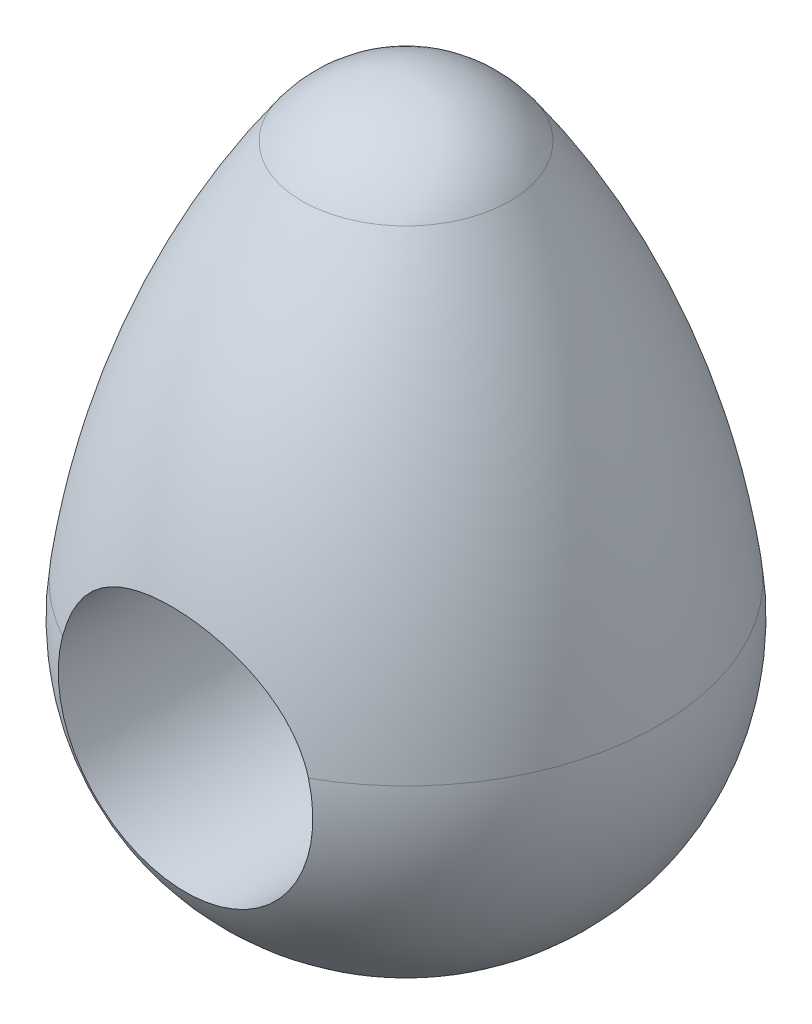
ISO-10303-21;
HEADER;
FILE_DESCRIPTION(('STEP AP214'),'2;1');
FILE_NAME('part.step','',(''),(''),'','','');
FILE_SCHEMA(('AUTOMOTIVE_DESIGN { 1 0 10303 214 1 1 1 1 }'));
ENDSEC;
DATA;
#1=APPLICATION_CONTEXT('core data for automotive mechanical design processes');
#2=APPLICATION_PROTOCOL_DEFINITION('international standard','automotive_design',2000,#1);
#3=PRODUCT_CONTEXT('',#1,'mechanical');
#4=PRODUCT('Part','Part','',(#3));
#5=PRODUCT_RELATED_PRODUCT_CATEGORY('part','',(#4));
#6=PRODUCT_DEFINITION_FORMATION('','',#4);
#7=PRODUCT_DEFINITION_CONTEXT('part definition',#1,'design');
#8=PRODUCT_DEFINITION('design','',#6,#7);
#9=PRODUCT_DEFINITION_SHAPE('','',#8);
#10=(LENGTH_UNIT() NAMED_UNIT(*) SI_UNIT(.MILLI.,.METRE.));
#11=(NAMED_UNIT(*) PLANE_ANGLE_UNIT() SI_UNIT($,.RADIAN.));
#12=(NAMED_UNIT(*) SI_UNIT($,.STERADIAN.) SOLID_ANGLE_UNIT());
#13=UNCERTAINTY_MEASURE_WITH_UNIT(LENGTH_MEASURE(1.E-05),#10,'distance_accuracy_value','');
#14=(GEOMETRIC_REPRESENTATION_CONTEXT(3) GLOBAL_UNCERTAINTY_ASSIGNED_CONTEXT((#13)) GLOBAL_UNIT_ASSIGNED_CONTEXT((#10,
#11,#12)) REPRESENTATION_CONTEXT('',''));
#15=CARTESIAN_POINT('',(0.,0.,0.));
#16=DIRECTION('',(0.,0.,1.));
#17=DIRECTION('',(1.,0.,0.));
#18=AXIS2_PLACEMENT_3D('',#15,#16,#17);
#19=CARTESIAN_POINT('',(0.,-11.509375,0.));
#20=DIRECTION('',(0.,1.,0.));
#21=DIRECTION('',(-1.,0.,0.));
#22=AXIS2_PLACEMENT_3D('',#19,#20,#21);
#23=DEGENERATE_TOROIDAL_SURFACE('',#22,88.1518252057742,127.,.F.);
#24=CARTESIAN_POINT('',(0.,61.7957720588235,0.));
#25=DIRECTION('',(0.,1.,0.));
#26=DIRECTION('',(-1.,0.,0.));
#27=AXIS2_PLACEMENT_3D('',#24,#25,#26);
#28=CIRCLE('',#27,15.5562044480778);
#29=CARTESIAN_POINT('',(-15.5562044480778,61.7957720588235,0.));
#30=VERTEX_POINT('',#29);
#31=EDGE_CURVE('E71',#30,#30,#28,.T.);
#32=ORIENTED_EDGE('',*,*,#31,.F.);
#33=EDGE_LOOP('',(#32));
#34=FACE_BOUND('',#33,.T.);
#35=CARTESIAN_POINT('',(0.,4.93258928571428,0.));
#36=DIRECTION('',(0.,1.,0.));
#37=DIRECTION('',(-1.,0.,0.));
#38=AXIS2_PLACEMENT_3D('',#35,#36,#37);
#39=CIRCLE('',#38,37.7793536596175);
#40=CARTESIAN_POINT('',(-18.4003277943209,4.93258928571428,-32.9955678841871));
#41=VERTEX_POINT('',#40);
#42=CARTESIAN_POINT('',(-18.4003277943209,4.93258928571428,32.9955678841871));
#43=VERTEX_POINT('',#42);
#44=EDGE_CURVE('E75',#41,#43,#39,.T.);
#45=ORIENTED_EDGE('',*,*,#44,.T.);
#46=CARTESIAN_POINT('',(-18.4003814073016,4.93238928571425,32.9955678846186));
#47=CARTESIAN_POINT('',(-18.3325692378468,5.1853672871345,32.9955632520456));
#48=CARTESIAN_POINT('',(-18.2595467511236,5.43691121322279,32.9976376915696));
#49=CARTESIAN_POINT('',(-18.1032197433763,5.93670794981394,33.0057804716793));
#50=CARTESIAN_POINT('',(-18.019915615175,6.18496088565204,33.0118486597171));
#51=CARTESIAN_POINT('',(-17.7548887517165,6.92387522215485,33.0357879496352));
#52=CARTESIAN_POINT('',(-17.5579679688402,7.40900365058438,33.0593941774615));
#53=CARTESIAN_POINT('',(-17.1258873972779,8.35932467890844,33.1200474514089));
#54=CARTESIAN_POINT('',(-16.8908343786673,8.82456848781711,33.1570573141032));
#55=CARTESIAN_POINT('',(-16.3839029208377,9.73349869727592,33.2424019097334));
#56=CARTESIAN_POINT('',(-16.1120217148769,10.1771834747838,33.290737493721));
#57=CARTESIAN_POINT('',(-15.5337725359616,11.0396425477774,33.3962994988974));
#58=CARTESIAN_POINT('',(-15.2274414981497,11.4584428002188,33.45351642259));
#59=CARTESIAN_POINT('',(-14.5821748418402,12.2691102481379,33.5743654112764));
#60=CARTESIAN_POINT('',(-14.2432396085553,12.6609777617272,33.6379974004779));
#61=CARTESIAN_POINT('',(-13.5347390941466,13.4157148831882,33.769150833754));
#62=CARTESIAN_POINT('',(-13.165155171789,13.7785665755304,33.8366746371919));
#63=CARTESIAN_POINT('',(-12.397814102188,14.4728865180419,33.9730224091488));
#64=CARTESIAN_POINT('',(-12.0000562539283,14.8043539868373,34.0418464099878));
#65=CARTESIAN_POINT('',(-11.1639034560396,15.4452959077193,34.1807800736985));
#66=CARTESIAN_POINT('',(-10.7245594835262,15.7535429527428,34.2508463374984));
#67=CARTESIAN_POINT('',(-9.82099177300173,16.3321286712956,34.3870912951737));
#68=CARTESIAN_POINT('',(-9.35676744873765,16.6024664510297,34.4532698973674));
#69=CARTESIAN_POINT('',(-8.40650321143632,17.1032632619991,34.5793119277008));
#70=CARTESIAN_POINT('',(-7.92046521993054,17.3337257971323,34.639175910535));
#71=CARTESIAN_POINT('',(-6.92980876009838,17.7530147570815,34.7504269979082));
#72=CARTESIAN_POINT('',(-6.42519061977223,17.9418419164868,34.8018142520013));
#73=CARTESIAN_POINT('',(-5.4032948736185,18.2755149356398,34.8940413904054));
#74=CARTESIAN_POINT('',(-4.88608739441805,18.4205620742132,34.9349294112518));
#75=CARTESIAN_POINT('',(-3.84050403657987,18.6665866702841,35.0050037534114));
#76=CARTESIAN_POINT('',(-3.31212815303506,18.7675641084183,35.0341900695832));
#77=CARTESIAN_POINT('',(-2.24831348498067,18.9244972415352,35.0798034688701));
#78=CARTESIAN_POINT('',(-1.71287645793996,18.9804639321742,35.0962336681376));
#79=CARTESIAN_POINT('',(-0.638951163494665,19.0468802669719,35.1157513304853));
#80=CARTESIAN_POINT('',(-0.100462989147115,19.0573312919118,35.1188391983236));
#81=CARTESIAN_POINT('',(0.955248877682496,19.033084081467,35.1116997184402));
#82=CARTESIAN_POINT('',(1.47251520627609,19.000058501673,35.1019656547779));
#83=CARTESIAN_POINT('',(2.50225904045697,18.8920405387348,35.070362151926));
#84=CARTESIAN_POINT('',(3.01473667336061,18.8170492745722,35.0484930363081));
#85=CARTESIAN_POINT('',(4.03130361949039,18.6257513176979,34.9933500761005));
#86=CARTESIAN_POINT('',(4.53539267606178,18.5094433632953,34.9600758832343));
#87=CARTESIAN_POINT('',(5.53171919029677,18.2364851005572,34.8832311244395));
#88=CARTESIAN_POINT('',(6.02395648963525,18.0798342536161,34.8396604210459));
#89=CARTESIAN_POINT('',(6.99394676775983,17.7272068868756,34.7436071647194));
#90=CARTESIAN_POINT('',(7.4716804367393,17.5311803773775,34.6911132964674));
#91=CARTESIAN_POINT('',(8.40897393423809,17.1013883513432,34.5789973726089));
#92=CARTESIAN_POINT('',(8.86853378789943,16.8676228870181,34.5193753268641));
#93=CARTESIAN_POINT('',(9.76681144446945,16.3638969110162,34.3949744996921));
#94=CARTESIAN_POINT('',(10.2055231736492,16.0939259380061,34.3301942300375));
#95=CARTESIAN_POINT('',(11.0593447365764,15.5196058603114,34.1976866520269));
#96=CARTESIAN_POINT('',(11.4744540283124,15.2152559666206,34.1299592760558));
#97=CARTESIAN_POINT('',(12.2941217447092,14.561667777124,33.9912817128084));
#98=CARTESIAN_POINT('',(12.6976642451539,14.211155225064,33.9203075755617));
#99=CARTESIAN_POINT('',(13.2798614301843,13.6608620058197,33.8154466504689));
#100=CARTESIAN_POINT('',(13.47008600651,13.4733305521061,33.7807575202586));
#101=CARTESIAN_POINT('',(13.8426124724727,13.0903006341814,33.7122478838022));
#102=CARTESIAN_POINT('',(14.0249121451749,12.894799969902,33.6784276216844));
#103=CARTESIAN_POINT('',(14.5591037271091,12.2971661832145,33.5788658017228));
#104=CARTESIAN_POINT('',(14.8986501601278,11.8835591330501,33.5149569119623));
#105=CARTESIAN_POINT('',(15.5421718276563,11.0285851730213,33.3948874518236));
#106=CARTESIAN_POINT('',(15.8461501795282,10.5872207011753,33.3387262023268));
#107=CARTESIAN_POINT('',(16.3828145941636,9.73291203723232,33.2428423958318));
#108=CARTESIAN_POINT('',(16.6196807030292,9.3227202408887,33.2019637466421));
#109=CARTESIAN_POINT('',(17.0624787785542,8.48520307036341,33.1300876027153));
#110=CARTESIAN_POINT('',(17.2684153127407,8.05788023784016,33.0990886482335));
#111=CARTESIAN_POINT('',(17.6483481944515,7.18776263017201,33.0484742690229));
#112=CARTESIAN_POINT('',(17.8222954662588,6.74494530283764,33.0288762367966));
#113=CARTESIAN_POINT('',(18.0580787278608,6.07164981471703,33.0090330330041));
#114=CARTESIAN_POINT('',(18.1325008231787,5.84564197033814,33.004010872121));
#115=CARTESIAN_POINT('',(18.2728433533698,5.39094627461883,32.9972765430655));
#116=CARTESIAN_POINT('',(18.3387635409758,5.16225834554243,32.9955644711425));
#117=CARTESIAN_POINT('',(18.4003814073016,4.93238928571425,32.9955678846186));
#118=B_SPLINE_CURVE_WITH_KNOTS('',3,(#46,#47,#48,#49,#50,#51,#52,#53,#54,#55,#56,#57,#58,#59,
#60,#61,#62,#63,#64,#65,#66,#67,#68,#69,#70,#71,#72,#73,#74,#75,#76,#77,#78,#79,#80,#81,#82,#83,
#84,#85,#86,#87,#88,#89,#90,#91,#92,#93,#94,#95,#96,#97,#98,#99,#100,#101,#102,#103,#104,#105,
#106,#107,#108,#109,#110,#111,#112,#113,#114,#115,#116,#117),.UNSPECIFIED.,.F.,.F.,(4,2,2,2,2,2,
2,2,2,2,2,2,2,2,2,2,2,2,2,2,2,2,2,2,2,2,2,2,2,2,2,2,2,2,2,4),(0.,0.785592608663274,
1.57115521208649,3.14131623918109,4.70715438824781,6.27311023724102,7.83740288229302,
9.40167704778164,10.9669097186132,12.5321813488452,14.1540099698482,15.7758768226412,
17.3976010870874,19.0192967365233,20.6334189032943,22.2475417792797,23.861270222001,
25.4749497096791,27.0283251669249,28.5816592066206,30.1350406846731,31.6884429025208,
33.2438298633424,34.7992146723339,36.3550498712952,37.9109207843802,39.5264882603318,
40.334376992754,41.1424902907502,42.7572143057528,44.3717966921945,45.7967044552762,
47.2214015876713,48.6482664837129,49.3620980385694,50.0759503496332),.UNSPECIFIED.);
#119=CARTESIAN_POINT('',(18.4003277943209,4.93258928571428,32.9955678841871));
#120=VERTEX_POINT('',#119);
#121=EDGE_CURVE('E61',#43,#120,#118,.T.);
#122=ORIENTED_EDGE('',*,*,#121,.T.);
#123=CARTESIAN_POINT('',(18.4003277943209,4.93258928571428,-32.9955678841871));
#124=VERTEX_POINT('',#123);
#125=EDGE_CURVE('E74',#120,#124,#39,.T.);
#126=ORIENTED_EDGE('',*,*,#125,.T.);
#127=CARTESIAN_POINT('',(18.4003814073016,4.93238928571425,-32.9955678846187));
#128=CARTESIAN_POINT('',(18.3325692378468,5.1853672871345,-32.9955632520456));
#129=CARTESIAN_POINT('',(18.2595467511235,5.43691121322279,-32.9976376915697));
#130=CARTESIAN_POINT('',(18.1032197433763,5.93670794981394,-33.0057804716793));
#131=CARTESIAN_POINT('',(18.019915615175,6.18496088565204,-33.0118486597171));
#132=CARTESIAN_POINT('',(17.7548887517165,6.92387522215486,-33.0357879496352));
#133=CARTESIAN_POINT('',(17.5579679688402,7.40900365058438,-33.0593941774615));
#134=CARTESIAN_POINT('',(17.1258873972779,8.35932467890844,-33.1200474514089));
#135=CARTESIAN_POINT('',(16.8908343786673,8.82456848781712,-33.1570573141032));
#136=CARTESIAN_POINT('',(16.3839029208377,9.73349869727593,-33.2424019097334));
#137=CARTESIAN_POINT('',(16.1120217148769,10.1771834747838,-33.290737493721));
#138=CARTESIAN_POINT('',(15.5337725359616,11.0396425477774,-33.3962994988974));
#139=CARTESIAN_POINT('',(15.2274414981497,11.4584428002188,-33.45351642259));
#140=CARTESIAN_POINT('',(14.5821748418402,12.2691102481379,-33.5743654112764));
#141=CARTESIAN_POINT('',(14.2432396085553,12.6609777617272,-33.6379974004779));
#142=CARTESIAN_POINT('',(13.5347390941466,13.4157148831882,-33.769150833754));
#143=CARTESIAN_POINT('',(13.165155171789,13.7785665755304,-33.8366746371919));
#144=CARTESIAN_POINT('',(12.397814102188,14.4728865180419,-33.9730224091488));
#145=CARTESIAN_POINT('',(12.0000562539283,14.8043539868373,-34.0418464099878));
#146=CARTESIAN_POINT('',(11.1639034560396,15.4452959077193,-34.1807800736985));
#147=CARTESIAN_POINT('',(10.7245594835262,15.7535429527428,-34.2508463374984));
#148=CARTESIAN_POINT('',(9.82099177300173,16.3321286712956,-34.3870912951737));
#149=CARTESIAN_POINT('',(9.35676744873764,16.6024664510297,-34.4532698973674));
#150=CARTESIAN_POINT('',(8.40650321143632,17.1032632619991,-34.5793119277008));
#151=CARTESIAN_POINT('',(7.92046521993053,17.3337257971323,-34.639175910535));
#152=CARTESIAN_POINT('',(6.92980876009837,17.7530147570815,-34.7504269979082));
#153=CARTESIAN_POINT('',(6.42519061977222,17.9418419164868,-34.8018142520013));
#154=CARTESIAN_POINT('',(5.40329487361849,18.2755149356398,-34.8940413904055));
#155=CARTESIAN_POINT('',(4.88608739441804,18.4205620742132,-34.9349294112518));
#156=CARTESIAN_POINT('',(3.84050403657986,18.6665866702841,-35.0050037534114));
#157=CARTESIAN_POINT('',(3.31212815303505,18.7675641084183,-35.0341900695832));
#158=CARTESIAN_POINT('',(2.24831348498066,18.9244972415352,-35.0798034688701));
#159=CARTESIAN_POINT('',(1.71287645793995,18.9804639321742,-35.0962336681376));
#160=CARTESIAN_POINT('',(0.638951163494655,19.0468802669719,-35.1157513304853));
#161=CARTESIAN_POINT('',(0.100462989147105,19.0573312919118,-35.1188391983236));
#162=CARTESIAN_POINT('',(-0.955248877682504,19.033084081467,-35.1116997184401));
#163=CARTESIAN_POINT('',(-1.47251520627609,19.000058501673,-35.1019656547779));
#164=CARTESIAN_POINT('',(-2.50225904045697,18.8920405387348,-35.070362151926));
#165=CARTESIAN_POINT('',(-3.01473667336061,18.8170492745722,-35.0484930363081));
#166=CARTESIAN_POINT('',(-4.0313036194904,18.6257513176979,-34.9933500761006));
#167=CARTESIAN_POINT('',(-4.53539267606179,18.5094433632953,-34.9600758832343));
#168=CARTESIAN_POINT('',(-5.53171919029678,18.2364851005572,-34.8832311244395));
#169=CARTESIAN_POINT('',(-6.02395648963525,18.0798342536161,-34.8396604210459));
#170=CARTESIAN_POINT('',(-6.99394676775984,17.7272068868756,-34.7436071647194));
#171=CARTESIAN_POINT('',(-7.47168043673931,17.5311803773775,-34.6911132964674));
#172=CARTESIAN_POINT('',(-8.40897393423809,17.1013883513432,-34.5789973726089));
#173=CARTESIAN_POINT('',(-8.86853378789943,16.8676228870181,-34.5193753268641));
#174=CARTESIAN_POINT('',(-9.76681144446945,16.3638969110162,-34.3949744996921));
#175=CARTESIAN_POINT('',(-10.2055231736492,16.0939259380061,-34.3301942300375));
#176=CARTESIAN_POINT('',(-11.0593447365764,15.5196058603114,-34.1976866520269));
#177=CARTESIAN_POINT('',(-11.4744540283124,15.2152559666206,-34.1299592760558));
#178=CARTESIAN_POINT('',(-12.2941217447092,14.561667777124,-33.9912817128084));
#179=CARTESIAN_POINT('',(-12.6976642451539,14.211155225064,-33.9203075755617));
#180=CARTESIAN_POINT('',(-13.2798614301843,13.6608620058197,-33.8154466504689));
#181=CARTESIAN_POINT('',(-13.47008600651,13.4733305521061,-33.7807575202586));
#182=CARTESIAN_POINT('',(-13.8426124724727,13.0903006341814,-33.7122478838022));
#183=CARTESIAN_POINT('',(-14.0249121451749,12.894799969902,-33.6784276216844));
#184=CARTESIAN_POINT('',(-14.5591037271091,12.2971661832145,-33.5788658017228));
#185=CARTESIAN_POINT('',(-14.8986501601278,11.8835591330501,-33.5149569119623));
#186=CARTESIAN_POINT('',(-15.5421718276563,11.0285851730213,-33.3948874518236));
#187=CARTESIAN_POINT('',(-15.8461501795282,10.5872207011753,-33.3387262023268));
#188=CARTESIAN_POINT('',(-16.3828145941636,9.73291203723232,-33.2428423958318));
#189=CARTESIAN_POINT('',(-16.6196807030292,9.32272024088869,-33.201963746642));
#190=CARTESIAN_POINT('',(-17.0624787785542,8.48520307036341,-33.1300876027153));
#191=CARTESIAN_POINT('',(-17.2684153127407,8.05788023784016,-33.0990886482335));
#192=CARTESIAN_POINT('',(-17.6483481944515,7.18776263017201,-33.0484742690229));
#193=CARTESIAN_POINT('',(-17.8222954662588,6.74494530283764,-33.0288762367966));
#194=CARTESIAN_POINT('',(-18.0580787278608,6.07164981471703,-33.0090330330041));
#195=CARTESIAN_POINT('',(-18.1325008231787,5.84564197033815,-33.004010872121));
#196=CARTESIAN_POINT('',(-18.2728433533698,5.39094627461883,-32.9972765430654));
#197=CARTESIAN_POINT('',(-18.3387635409758,5.16225834554244,-32.9955644711424));
#198=CARTESIAN_POINT('',(-18.4003814073016,4.93238928571425,-32.9955678846186));
#199=B_SPLINE_CURVE_WITH_KNOTS('',3,(#127,#128,#129,#130,#131,#132,#133,#134,#135,#136,#137,
#138,#139,#140,#141,#142,#143,#144,#145,#146,#147,#148,#149,#150,#151,#152,#153,#154,#155,#156,
#157,#158,#159,#160,#161,#162,#163,#164,#165,#166,#167,#168,#169,#170,#171,#172,#173,#174,#175,
#176,#177,#178,#179,#180,#181,#182,#183,#184,#185,#186,#187,#188,#189,#190,#191,#192,#193,#194,
#195,#196,#197,#198),.UNSPECIFIED.,.F.,.F.,(4,2,2,2,2,2,2,2,2,2,2,2,2,2,2,2,2,2,2,2,2,2,2,2,2,2,
2,2,2,2,2,2,2,2,2,4),(0.,0.785592608663276,1.57115521208649,3.1413162391811,4.70715438824782,
6.27311023724102,7.83740288229303,9.40167704778165,10.9669097186132,12.5321813488452,
14.1540099698482,15.7758768226412,17.3976010870874,19.0192967365233,20.6334189032943,
22.2475417792797,23.861270222001,25.4749497096792,27.028325166925,28.5816592066206,
30.1350406846731,31.6884429025208,33.2438298633424,34.7992146723339,36.3550498712952,
37.9109207843803,39.5264882603318,40.3343769927541,41.1424902907503,42.7572143057528,
44.3717966921945,45.7967044552762,47.2214015876713,48.6482664837129,49.3620980385694,
50.0759503496333),.UNSPECIFIED.);
#200=EDGE_CURVE('E54',#124,#41,#199,.T.);
#201=ORIENTED_EDGE('',*,*,#200,.T.);
#202=EDGE_LOOP('',(#45,#122,#126,#201));
#203=FACE_BOUND('',#202,.T.);
#204=ADVANCED_FACE('F41',(#34,#203),#23,.F.);
#205=CARTESIAN_POINT('',(0.,0.,0.));
#206=DIRECTION('',(0.,1.,0.));
#207=DIRECTION('',(-1.,0.,0.));
#208=AXIS2_PLACEMENT_3D('',#205,#206,#207);
#209=SPHERICAL_SURFACE('',#208,38.1);
#210=CARTESIAN_POINT('',(0.,0.,-32.9955678841871));
#211=DIRECTION('',(0.,0.,1.));
#212=DIRECTION('',(1.,0.,0.));
#213=AXIS2_PLACEMENT_3D('',#210,#211,#212);
#214=CIRCLE('',#213,19.05);
#215=EDGE_CURVE('E11',#124,#41,#214,.F.);
#216=ORIENTED_EDGE('',*,*,#215,.F.);
#217=ORIENTED_EDGE('',*,*,#125,.F.);
#218=CARTESIAN_POINT('',(0.,0.,32.9955678841871));
#219=DIRECTION('',(0.,0.,-1.));
#220=DIRECTION('',(-1.,0.,0.));
#221=AXIS2_PLACEMENT_3D('',#218,#219,#220);
#222=CIRCLE('',#221,19.05);
#223=EDGE_CURVE('E49',#43,#120,#222,.F.);
#224=ORIENTED_EDGE('',*,*,#223,.F.);
#225=ORIENTED_EDGE('',*,*,#44,.F.);
#226=EDGE_LOOP('',(#216,#217,#224,#225));
#227=FACE_BOUND('',#226,.T.);
#228=ADVANCED_FACE('F77',(#227),#209,.T.);
#229=CARTESIAN_POINT('',(0.,50.8,0.));
#230=DIRECTION('',(0.,1.,0.));
#231=DIRECTION('',(1.,0.,0.));
#232=AXIS2_PLACEMENT_3D('',#229,#230,#231);
#233=SPHERICAL_SURFACE('',#232,19.05);
#234=ORIENTED_EDGE('',*,*,#31,.T.);
#235=EDGE_LOOP('',(#234));
#236=FACE_BOUND('',#235,.T.);
#237=ADVANCED_FACE('F94',(#236),#233,.T.);
#238=CARTESIAN_POINT('',(0.,0.,38.1));
#239=DIRECTION('',(0.,0.,-1.));
#240=DIRECTION('',(-1.,0.,0.));
#241=AXIS2_PLACEMENT_3D('',#238,#239,#240);
#242=CYLINDRICAL_SURFACE('',#241,19.05);
#243=ORIENTED_EDGE('',*,*,#215,.T.);
#244=ORIENTED_EDGE('',*,*,#200,.F.);
#245=EDGE_LOOP('',(#243,#244));
#246=FACE_BOUND('',#245,.T.);
#247=ORIENTED_EDGE('',*,*,#223,.T.);
#248=ORIENTED_EDGE('',*,*,#121,.F.);
#249=EDGE_LOOP('',(#247,#248));
#250=FACE_BOUND('',#249,.T.);
#251=ADVANCED_FACE('F66',(#246,#250),#242,.F.);
#252=CLOSED_SHELL('',(#204,#228,#237,#251));
#253=MANIFOLD_SOLID_BREP('B2',#252);
#254=ADVANCED_BREP_SHAPE_REPRESENTATION('',(#18,#253),#14);
#255=SHAPE_DEFINITION_REPRESENTATION(#9,#254);
ENDSEC;
END-ISO-10303-21;
